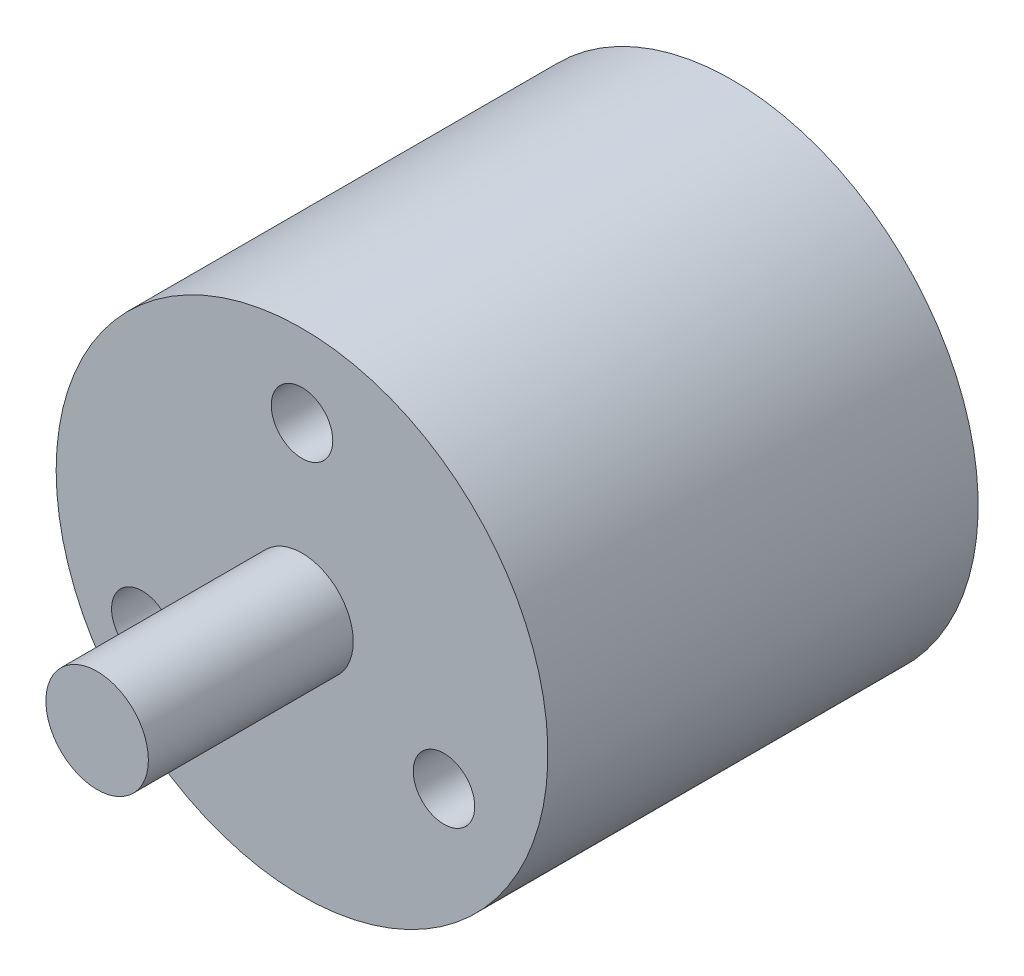
ISO-10303-21;
HEADER;
FILE_DESCRIPTION(('STEP AP214'),'2;1');
FILE_NAME('part.step','',(''),(''),'','','');
FILE_SCHEMA(('AUTOMOTIVE_DESIGN { 1 0 10303 214 1 1 1 1 }'));
ENDSEC;
DATA;
#1=APPLICATION_CONTEXT('core data for automotive mechanical design processes');
#2=APPLICATION_PROTOCOL_DEFINITION('international standard','automotive_design',2000,#1);
#3=PRODUCT_CONTEXT('',#1,'mechanical');
#4=PRODUCT('Part','Part','',(#3));
#5=PRODUCT_RELATED_PRODUCT_CATEGORY('part','',(#4));
#6=PRODUCT_DEFINITION_FORMATION('','',#4);
#7=PRODUCT_DEFINITION_CONTEXT('part definition',#1,'design');
#8=PRODUCT_DEFINITION('design','',#6,#7);
#9=PRODUCT_DEFINITION_SHAPE('','',#8);
#10=(LENGTH_UNIT() NAMED_UNIT(*) SI_UNIT(.MILLI.,.METRE.));
#11=(NAMED_UNIT(*) PLANE_ANGLE_UNIT() SI_UNIT($,.RADIAN.));
#12=(NAMED_UNIT(*) SI_UNIT($,.STERADIAN.) SOLID_ANGLE_UNIT());
#13=UNCERTAINTY_MEASURE_WITH_UNIT(LENGTH_MEASURE(1.E-05),#10,'distance_accuracy_value','');
#14=(GEOMETRIC_REPRESENTATION_CONTEXT(3) GLOBAL_UNCERTAINTY_ASSIGNED_CONTEXT((#13)) GLOBAL_UNIT_ASSIGNED_CONTEXT((#10,
#11,#12)) REPRESENTATION_CONTEXT('',''));
#15=CARTESIAN_POINT('',(0.,0.,0.));
#16=DIRECTION('',(0.,0.,1.));
#17=DIRECTION('',(1.,0.,0.));
#18=AXIS2_PLACEMENT_3D('',#15,#16,#17);
#19=CARTESIAN_POINT('',(0.,0.,21.));
#20=DIRECTION('',(0.,0.,-1.));
#21=DIRECTION('',(-1.,0.,0.));
#22=AXIS2_PLACEMENT_3D('',#19,#20,#21);
#23=CYLINDRICAL_SURFACE('',#22,12.);
#24=CARTESIAN_POINT('',(0.,0.,21.));
#25=DIRECTION('',(0.,0.,1.));
#26=DIRECTION('',(1.,0.,0.));
#27=AXIS2_PLACEMENT_3D('',#24,#25,#26);
#28=CIRCLE('',#27,12.);
#29=CARTESIAN_POINT('',(-12.,0.,21.));
#30=VERTEX_POINT('',#29);
#31=EDGE_CURVE('E38',#30,#30,#28,.T.);
#32=CARTESIAN_POINT('',(0.,0.,0.));
#33=DIRECTION('',(0.,0.,1.));
#34=DIRECTION('',(1.,0.,0.));
#35=AXIS2_PLACEMENT_3D('',#32,#33,#34);
#36=CIRCLE('',#35,12.);
#37=CARTESIAN_POINT('',(-12.,0.,0.));
#38=VERTEX_POINT('',#37);
#39=EDGE_CURVE('E34',#38,#38,#36,.T.);
#40=CARTESIAN_POINT('',(-12.,0.,21.));
#41=CARTESIAN_POINT('',(-12.,0.,20.78125));
#42=CARTESIAN_POINT('',(-12.,0.,20.5625));
#43=CARTESIAN_POINT('',(-12.,0.,20.125));
#44=CARTESIAN_POINT('',(-12.,0.,19.90625));
#45=CARTESIAN_POINT('',(-12.,0.,19.46875));
#46=CARTESIAN_POINT('',(-12.,0.,19.25));
#47=CARTESIAN_POINT('',(-12.,0.,18.8125));
#48=CARTESIAN_POINT('',(-12.,0.,18.59375));
#49=CARTESIAN_POINT('',(-12.,0.,18.15625));
#50=CARTESIAN_POINT('',(-12.,0.,17.9375));
#51=CARTESIAN_POINT('',(-12.,0.,17.5));
#52=CARTESIAN_POINT('',(-12.,0.,17.28125));
#53=CARTESIAN_POINT('',(-12.,0.,16.84375));
#54=CARTESIAN_POINT('',(-12.,0.,16.625));
#55=CARTESIAN_POINT('',(-12.,0.,16.1875));
#56=CARTESIAN_POINT('',(-12.,0.,15.96875));
#57=CARTESIAN_POINT('',(-12.,0.,15.53125));
#58=CARTESIAN_POINT('',(-12.,0.,15.3125));
#59=CARTESIAN_POINT('',(-12.,0.,14.875));
#60=CARTESIAN_POINT('',(-12.,0.,14.65625));
#61=CARTESIAN_POINT('',(-12.,0.,14.21875));
#62=CARTESIAN_POINT('',(-12.,0.,14.));
#63=CARTESIAN_POINT('',(-12.,0.,13.5625));
#64=CARTESIAN_POINT('',(-12.,0.,13.34375));
#65=CARTESIAN_POINT('',(-12.,0.,12.90625));
#66=CARTESIAN_POINT('',(-12.,0.,12.6875));
#67=CARTESIAN_POINT('',(-12.,0.,12.25));
#68=CARTESIAN_POINT('',(-12.,0.,12.03125));
#69=CARTESIAN_POINT('',(-12.,0.,11.59375));
#70=CARTESIAN_POINT('',(-12.,0.,11.375));
#71=CARTESIAN_POINT('',(-12.,0.,10.9375));
#72=CARTESIAN_POINT('',(-12.,0.,10.71875));
#73=CARTESIAN_POINT('',(-12.,0.,10.28125));
#74=CARTESIAN_POINT('',(-12.,0.,10.0625));
#75=CARTESIAN_POINT('',(-12.,0.,9.625));
#76=CARTESIAN_POINT('',(-12.,0.,9.40625));
#77=CARTESIAN_POINT('',(-12.,0.,8.96875));
#78=CARTESIAN_POINT('',(-12.,0.,8.75));
#79=CARTESIAN_POINT('',(-12.,0.,8.3125));
#80=CARTESIAN_POINT('',(-12.,0.,8.09375));
#81=CARTESIAN_POINT('',(-12.,0.,7.65625));
#82=CARTESIAN_POINT('',(-12.,0.,7.4375));
#83=CARTESIAN_POINT('',(-12.,0.,7.));
#84=CARTESIAN_POINT('',(-12.,0.,6.78125));
#85=CARTESIAN_POINT('',(-12.,0.,6.34375));
#86=CARTESIAN_POINT('',(-12.,0.,6.125));
#87=CARTESIAN_POINT('',(-12.,0.,5.6875));
#88=CARTESIAN_POINT('',(-12.,0.,5.46875));
#89=CARTESIAN_POINT('',(-12.,0.,5.03125));
#90=CARTESIAN_POINT('',(-12.,0.,4.8125));
#91=CARTESIAN_POINT('',(-12.,0.,4.375));
#92=CARTESIAN_POINT('',(-12.,0.,4.15625));
#93=CARTESIAN_POINT('',(-12.,0.,3.71875));
#94=CARTESIAN_POINT('',(-12.,0.,3.5));
#95=CARTESIAN_POINT('',(-12.,0.,3.0625));
#96=CARTESIAN_POINT('',(-12.,0.,2.84375));
#97=CARTESIAN_POINT('',(-12.,0.,2.40625));
#98=CARTESIAN_POINT('',(-12.,0.,2.1875));
#99=CARTESIAN_POINT('',(-12.,0.,1.75));
#100=CARTESIAN_POINT('',(-12.,0.,1.53125));
#101=CARTESIAN_POINT('',(-12.,0.,1.09375));
#102=CARTESIAN_POINT('',(-12.,0.,0.875000000000001));
#103=CARTESIAN_POINT('',(-12.,0.,0.4375));
#104=CARTESIAN_POINT('',(-12.,0.,0.21875));
#105=CARTESIAN_POINT('',(-12.,0.,0.));
#106=B_SPLINE_CURVE_WITH_KNOTS('',3,(#40,#41,#42,#43,#44,#45,#46,#47,#48,#49,#50,#51,#52,#53,
#54,#55,#56,#57,#58,#59,#60,#61,#62,#63,#64,#65,#66,#67,#68,#69,#70,#71,#72,#73,#74,#75,#76,#77,
#78,#79,#80,#81,#82,#83,#84,#85,#86,#87,#88,#89,#90,#91,#92,#93,#94,#95,#96,#97,#98,#99,#100,
#101,#102,#103,#104,#105),.UNSPECIFIED.,.F.,.F.,(4,2,2,2,2,2,2,2,2,2,2,2,2,2,2,2,2,2,2,2,2,2,2,
2,2,2,2,2,2,2,2,2,4),(0.,0.656249999999997,1.3125,1.96875,2.625,3.28125,3.9375,4.59375,5.25,
5.90625,6.5625,7.21875,7.875,8.53125,9.1875,9.84375,10.5,11.15625,11.8125,12.46875,13.125,
13.78125,14.4375,15.09375,15.75,16.40625,17.0625,17.71875,18.375,19.03125,19.6875,20.34375,21.),.UNSPECIFIED.);
#107=EDGE_CURVE('BSEAM31',#30,#38,#106,.T.);
#108=ORIENTED_EDGE('',*,*,#31,.F.);
#109=ORIENTED_EDGE('',*,*,#39,.T.);
#110=ORIENTED_EDGE('',*,*,#107,.T.);
#111=ORIENTED_EDGE('',*,*,#107,.F.);
#112=EDGE_LOOP('',(#108,#110,#109,#111));
#113=FACE_BOUND('',#112,.T.);
#114=ADVANCED_FACE('F31',(#113),#23,.T.);
#115=CARTESIAN_POINT('',(0.,0.,21.));
#116=DIRECTION('',(0.,0.,1.));
#117=DIRECTION('',(1.,0.,0.));
#118=AXIS2_PLACEMENT_3D('',#115,#116,#117);
#119=PLANE('',#118);
#120=CARTESIAN_POINT('',(0.,8.,21.));
#121=DIRECTION('',(0.,0.,1.));
#122=DIRECTION('',(1.,0.,0.));
#123=AXIS2_PLACEMENT_3D('',#120,#121,#122);
#124=CIRCLE('',#123,1.5);
#125=CARTESIAN_POINT('',(1.5,8.,21.));
#126=VERTEX_POINT('',#125);
#127=EDGE_CURVE('E60',#126,#126,#124,.T.);
#128=ORIENTED_EDGE('',*,*,#127,.F.);
#129=EDGE_LOOP('',(#128));
#130=FACE_BOUND('',#129,.T.);
#131=CARTESIAN_POINT('',(-7.79422863405996,-4.49999999999998,21.));
#132=DIRECTION('',(0.,0.,1.));
#133=DIRECTION('',(1.,0.,0.));
#134=AXIS2_PLACEMENT_3D('',#131,#132,#133);
#135=CIRCLE('',#134,1.50164961860319);
#136=CARTESIAN_POINT('',(-6.29257901545677,-4.49999999999998,21.));
#137=VERTEX_POINT('',#136);
#138=EDGE_CURVE('E54',#137,#137,#135,.T.);
#139=ORIENTED_EDGE('',*,*,#138,.F.);
#140=EDGE_LOOP('',(#139));
#141=FACE_BOUND('',#140,.T.);
#142=CARTESIAN_POINT('',(6.92820323027552,-3.99999999999998,21.));
#143=DIRECTION('',(0.,0.,1.));
#144=DIRECTION('',(1.,0.,0.));
#145=AXIS2_PLACEMENT_3D('',#142,#143,#144);
#146=CIRCLE('',#145,1.5);
#147=CARTESIAN_POINT('',(8.42820323027552,-3.99999999999998,21.));
#148=VERTEX_POINT('',#147);
#149=EDGE_CURVE('E48',#148,#148,#146,.T.);
#150=ORIENTED_EDGE('',*,*,#149,.F.);
#151=EDGE_LOOP('',(#150));
#152=FACE_BOUND('',#151,.T.);
#153=CARTESIAN_POINT('',(0.,0.,21.));
#154=DIRECTION('',(0.,0.,1.));
#155=DIRECTION('',(1.,0.,0.));
#156=AXIS2_PLACEMENT_3D('',#153,#154,#155);
#157=CIRCLE('',#156,2.5);
#158=CARTESIAN_POINT('',(2.5,0.,21.));
#159=VERTEX_POINT('',#158);
#160=EDGE_CURVE('E10',#159,#159,#157,.T.);
#161=ORIENTED_EDGE('',*,*,#160,.F.);
#162=EDGE_LOOP('',(#161));
#163=FACE_BOUND('',#162,.T.);
#164=ORIENTED_EDGE('',*,*,#31,.T.);
#165=EDGE_LOOP('',(#164));
#166=FACE_BOUND('',#165,.T.);
#167=ADVANCED_FACE('F75',(#130,#141,#152,#163,#166),#119,.T.);
#168=CARTESIAN_POINT('',(0.,0.,0.));
#169=DIRECTION('',(0.,0.,1.));
#170=DIRECTION('',(1.,0.,0.));
#171=AXIS2_PLACEMENT_3D('',#168,#169,#170);
#172=PLANE('',#171);
#173=ORIENTED_EDGE('',*,*,#39,.F.);
#174=EDGE_LOOP('',(#173));
#175=FACE_BOUND('',#174,.T.);
#176=ADVANCED_FACE('F78',(#175),#172,.F.);
#177=CARTESIAN_POINT('',(0.,0.,31.));
#178=DIRECTION('',(0.,0.,-1.));
#179=DIRECTION('',(-1.,0.,0.));
#180=AXIS2_PLACEMENT_3D('',#177,#178,#179);
#181=CYLINDRICAL_SURFACE('',#180,2.5);
#182=CARTESIAN_POINT('',(0.,0.,31.));
#183=DIRECTION('',(0.,0.,1.));
#184=DIRECTION('',(1.,0.,0.));
#185=AXIS2_PLACEMENT_3D('',#182,#183,#184);
#186=CIRCLE('',#185,2.5);
#187=CARTESIAN_POINT('',(2.5,0.,31.));
#188=VERTEX_POINT('',#187);
#189=EDGE_CURVE('E44',#188,#188,#186,.T.);
#190=ORIENTED_EDGE('',*,*,#189,.F.);
#191=EDGE_LOOP('',(#190));
#192=FACE_BOUND('',#191,.T.);
#193=ORIENTED_EDGE('',*,*,#160,.T.);
#194=EDGE_LOOP('',(#193));
#195=FACE_BOUND('',#194,.T.);
#196=ADVANCED_FACE('F93',(#192,#195),#181,.T.);
#197=CARTESIAN_POINT('',(0.,0.,31.));
#198=DIRECTION('',(0.,0.,1.));
#199=DIRECTION('',(1.,0.,0.));
#200=AXIS2_PLACEMENT_3D('',#197,#198,#199);
#201=PLANE('',#200);
#202=ORIENTED_EDGE('',*,*,#189,.T.);
#203=EDGE_LOOP('',(#202));
#204=FACE_BOUND('',#203,.T.);
#205=ADVANCED_FACE('F97',(#204),#201,.T.);
#206=CARTESIAN_POINT('',(6.92820323027552,-3.99999999999998,17.));
#207=DIRECTION('',(0.,0.,1.));
#208=DIRECTION('',(1.,0.,0.));
#209=AXIS2_PLACEMENT_3D('',#206,#207,#208);
#210=CYLINDRICAL_SURFACE('',#209,1.5);
#211=CARTESIAN_POINT('',(6.92820323027552,-3.99999999999998,17.));
#212=DIRECTION('',(0.,0.,1.));
#213=DIRECTION('',(1.,0.,0.));
#214=AXIS2_PLACEMENT_3D('',#211,#212,#213);
#215=CIRCLE('',#214,1.5);
#216=CARTESIAN_POINT('',(8.42820323027552,-3.99999999999998,17.));
#217=VERTEX_POINT('',#216);
#218=EDGE_CURVE('E51',#217,#217,#215,.T.);
#219=ORIENTED_EDGE('',*,*,#218,.F.);
#220=EDGE_LOOP('',(#219));
#221=FACE_BOUND('',#220,.T.);
#222=ORIENTED_EDGE('',*,*,#149,.T.);
#223=EDGE_LOOP('',(#222));
#224=FACE_BOUND('',#223,.T.);
#225=ADVANCED_FACE('F103',(#221,#224),#210,.F.);
#226=CARTESIAN_POINT('',(6.92820323027552,-3.99999999999998,17.));
#227=DIRECTION('',(0.,0.,1.));
#228=DIRECTION('',(1.,0.,0.));
#229=AXIS2_PLACEMENT_3D('',#226,#227,#228);
#230=PLANE('',#229);
#231=ORIENTED_EDGE('',*,*,#218,.T.);
#232=EDGE_LOOP('',(#231));
#233=FACE_BOUND('',#232,.T.);
#234=ADVANCED_FACE('F107',(#233),#230,.T.);
#235=CARTESIAN_POINT('',(-7.79422863405996,-4.49999999999998,17.));
#236=DIRECTION('',(0.,0.,1.));
#237=DIRECTION('',(1.,0.,0.));
#238=AXIS2_PLACEMENT_3D('',#235,#236,#237);
#239=CYLINDRICAL_SURFACE('',#238,1.50164961860319);
#240=CARTESIAN_POINT('',(-7.79422863405996,-4.49999999999998,17.));
#241=DIRECTION('',(0.,0.,1.));
#242=DIRECTION('',(1.,0.,0.));
#243=AXIS2_PLACEMENT_3D('',#240,#241,#242);
#244=CIRCLE('',#243,1.50164961860319);
#245=CARTESIAN_POINT('',(-6.29257901545677,-4.49999999999998,17.));
#246=VERTEX_POINT('',#245);
#247=EDGE_CURVE('E57',#246,#246,#244,.T.);
#248=ORIENTED_EDGE('',*,*,#247,.F.);
#249=EDGE_LOOP('',(#248));
#250=FACE_BOUND('',#249,.T.);
#251=ORIENTED_EDGE('',*,*,#138,.T.);
#252=EDGE_LOOP('',(#251));
#253=FACE_BOUND('',#252,.T.);
#254=ADVANCED_FACE('F111',(#250,#253),#239,.F.);
#255=CARTESIAN_POINT('',(-7.79422863405996,-4.49999999999998,17.));
#256=DIRECTION('',(0.,0.,1.));
#257=DIRECTION('',(1.,0.,0.));
#258=AXIS2_PLACEMENT_3D('',#255,#256,#257);
#259=PLANE('',#258);
#260=ORIENTED_EDGE('',*,*,#247,.T.);
#261=EDGE_LOOP('',(#260));
#262=FACE_BOUND('',#261,.T.);
#263=ADVANCED_FACE('F71',(#262),#259,.T.);
#264=CARTESIAN_POINT('',(0.,8.,17.));
#265=DIRECTION('',(0.,0.,1.));
#266=DIRECTION('',(1.,0.,0.));
#267=AXIS2_PLACEMENT_3D('',#264,#265,#266);
#268=CYLINDRICAL_SURFACE('',#267,1.5);
#269=CARTESIAN_POINT('',(0.,8.,17.));
#270=DIRECTION('',(0.,0.,1.));
#271=DIRECTION('',(1.,0.,0.));
#272=AXIS2_PLACEMENT_3D('',#269,#270,#271);
#273=CIRCLE('',#272,1.5);
#274=CARTESIAN_POINT('',(1.5,8.,17.));
#275=VERTEX_POINT('',#274);
#276=EDGE_CURVE('E47',#275,#275,#273,.T.);
#277=ORIENTED_EDGE('',*,*,#276,.F.);
#278=EDGE_LOOP('',(#277));
#279=FACE_BOUND('',#278,.T.);
#280=ORIENTED_EDGE('',*,*,#127,.T.);
#281=EDGE_LOOP('',(#280));
#282=FACE_BOUND('',#281,.T.);
#283=ADVANCED_FACE('F68',(#279,#282),#268,.F.);
#284=CARTESIAN_POINT('',(0.,8.,17.));
#285=DIRECTION('',(0.,0.,1.));
#286=DIRECTION('',(1.,0.,0.));
#287=AXIS2_PLACEMENT_3D('',#284,#285,#286);
#288=PLANE('',#287);
#289=ORIENTED_EDGE('',*,*,#276,.T.);
#290=EDGE_LOOP('',(#289));
#291=FACE_BOUND('',#290,.T.);
#292=ADVANCED_FACE('F66',(#291),#288,.T.);
#293=CLOSED_SHELL('',(#114,#167,#176,#196,#205,#225,#234,#254,#263,#283,#292));
#294=MANIFOLD_SOLID_BREP('B2',#293);
#295=ADVANCED_BREP_SHAPE_REPRESENTATION('',(#18,#294),#14);
#296=SHAPE_DEFINITION_REPRESENTATION(#9,#295);
ENDSEC;
END-ISO-10303-21;
